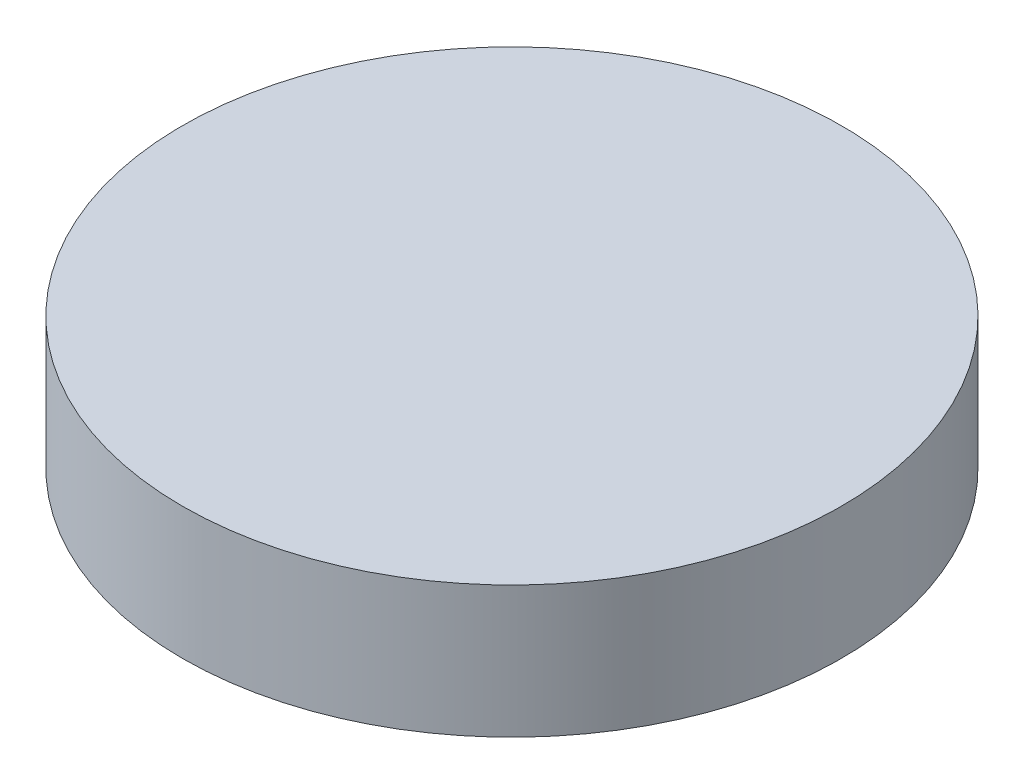
ISO-10303-21;
HEADER;
FILE_DESCRIPTION(('STEP AP214'),'2;1');
FILE_NAME('part.step','',(''),(''),'','','');
FILE_SCHEMA(('AUTOMOTIVE_DESIGN { 1 0 10303 214 1 1 1 1 }'));
ENDSEC;
DATA;
#1=APPLICATION_CONTEXT('core data for automotive mechanical design processes');
#2=APPLICATION_PROTOCOL_DEFINITION('international standard','automotive_design',2000,#1);
#3=PRODUCT_CONTEXT('',#1,'mechanical');
#4=PRODUCT('Part','Part','',(#3));
#5=PRODUCT_RELATED_PRODUCT_CATEGORY('part','',(#4));
#6=PRODUCT_DEFINITION_FORMATION('','',#4);
#7=PRODUCT_DEFINITION_CONTEXT('part definition',#1,'design');
#8=PRODUCT_DEFINITION('design','',#6,#7);
#9=PRODUCT_DEFINITION_SHAPE('','',#8);
#10=(LENGTH_UNIT() NAMED_UNIT(*) SI_UNIT(.MILLI.,.METRE.));
#11=(NAMED_UNIT(*) PLANE_ANGLE_UNIT() SI_UNIT($,.RADIAN.));
#12=(NAMED_UNIT(*) SI_UNIT($,.STERADIAN.) SOLID_ANGLE_UNIT());
#13=UNCERTAINTY_MEASURE_WITH_UNIT(LENGTH_MEASURE(1.E-05),#10,'distance_accuracy_value','');
#14=(GEOMETRIC_REPRESENTATION_CONTEXT(3) GLOBAL_UNCERTAINTY_ASSIGNED_CONTEXT((#13)) GLOBAL_UNIT_ASSIGNED_CONTEXT((#10,
#11,#12)) REPRESENTATION_CONTEXT('',''));
#15=CARTESIAN_POINT('',(0.,0.,0.));
#16=DIRECTION('',(0.,0.,1.));
#17=DIRECTION('',(1.,0.,0.));
#18=AXIS2_PLACEMENT_3D('',#15,#16,#17);
#19=CARTESIAN_POINT('',(0.,0.,0.));
#20=DIRECTION('',(0.,1.,0.));
#21=DIRECTION('',(0.,0.,1.));
#22=AXIS2_PLACEMENT_3D('',#19,#20,#21);
#23=PLANE('',#22);
#24=CARTESIAN_POINT('',(0.,0.,0.));
#25=DIRECTION('',(0.,1.,0.));
#26=DIRECTION('',(0.,0.,1.));
#27=AXIS2_PLACEMENT_3D('',#24,#25,#26);
#28=CIRCLE('',#27,330.);
#29=CARTESIAN_POINT('',(0.,0.,330.));
#30=VERTEX_POINT('',#29);
#31=EDGE_CURVE('E43',#30,#30,#28,.T.);
#32=ORIENTED_EDGE('',*,*,#31,.F.);
#33=EDGE_LOOP('',(#32));
#34=FACE_BOUND('',#33,.T.);
#35=DIRECTION('',(0.,0.,1.));
#36=VECTOR('',#35,1.);
#37=CARTESIAN_POINT('',(70.9937847516035,0.,-42.974654273376));
#38=LINE('',#37,#36);
#39=CARTESIAN_POINT('',(70.9937847516035,0.,-42.974654273376));
#40=VERTEX_POINT('',#39);
#41=CARTESIAN_POINT('',(70.9937847516035,0.,47.025345726624));
#42=VERTEX_POINT('',#41);
#43=EDGE_CURVE('E103',#40,#42,#38,.T.);
#44=ORIENTED_EDGE('',*,*,#43,.F.);
#45=DIRECTION('',(1.,0.,0.));
#46=VECTOR('',#45,1.);
#47=CARTESIAN_POINT('',(-19.0062152483965,0.,-42.974654273376));
#48=LINE('',#47,#46);
#49=CARTESIAN_POINT('',(-19.0062152483965,0.,-42.974654273376));
#50=VERTEX_POINT('',#49);
#51=EDGE_CURVE('E100',#50,#40,#48,.T.);
#52=ORIENTED_EDGE('',*,*,#51,.F.);
#53=DIRECTION('',(0.,0.,-1.));
#54=VECTOR('',#53,1.);
#55=CARTESIAN_POINT('',(-19.0062152483965,0.,-42.974654273376));
#56=LINE('',#55,#54);
#57=CARTESIAN_POINT('',(-19.0062152483965,0.,47.025345726624));
#58=VERTEX_POINT('',#57);
#59=EDGE_CURVE('E60',#58,#50,#56,.T.);
#60=ORIENTED_EDGE('',*,*,#59,.F.);
#61=DIRECTION('',(-1.,0.,0.));
#62=VECTOR('',#61,1.);
#63=CARTESIAN_POINT('',(-19.0062152483965,0.,47.025345726624));
#64=LINE('',#63,#62);
#65=EDGE_CURVE('E55',#42,#58,#64,.T.);
#66=ORIENTED_EDGE('',*,*,#65,.F.);
#67=EDGE_LOOP('',(#44,#52,#60,#66));
#68=FACE_BOUND('',#67,.T.);
#69=ADVANCED_FACE('F39',(#34,#68),#23,.F.);
#70=CARTESIAN_POINT('',(0.,132.,0.));
#71=DIRECTION('',(0.,-1.,0.));
#72=DIRECTION('',(0.,0.,-1.));
#73=AXIS2_PLACEMENT_3D('',#70,#71,#72);
#74=CYLINDRICAL_SURFACE('',#73,330.);
#75=CARTESIAN_POINT('',(0.,132.,0.));
#76=DIRECTION('',(0.,1.,0.));
#77=DIRECTION('',(0.,0.,1.));
#78=AXIS2_PLACEMENT_3D('',#75,#76,#77);
#79=CIRCLE('',#78,330.);
#80=CARTESIAN_POINT('',(0.,132.,330.));
#81=VERTEX_POINT('',#80);
#82=EDGE_CURVE('E11',#81,#81,#79,.T.);
#83=ORIENTED_EDGE('',*,*,#82,.F.);
#84=EDGE_LOOP('',(#83));
#85=FACE_BOUND('',#84,.T.);
#86=ORIENTED_EDGE('',*,*,#31,.T.);
#87=EDGE_LOOP('',(#86));
#88=FACE_BOUND('',#87,.T.);
#89=ADVANCED_FACE('F41',(#85,#88),#74,.T.);
#90=CARTESIAN_POINT('',(0.,132.,0.));
#91=DIRECTION('',(0.,1.,0.));
#92=DIRECTION('',(0.,0.,1.));
#93=AXIS2_PLACEMENT_3D('',#90,#91,#92);
#94=PLANE('',#93);
#95=ORIENTED_EDGE('',*,*,#82,.T.);
#96=EDGE_LOOP('',(#95));
#97=FACE_BOUND('',#96,.T.);
#98=ADVANCED_FACE('F140',(#97),#94,.T.);
#99=CARTESIAN_POINT('',(70.9937847516035,-34.,-42.974654273376));
#100=DIRECTION('',(-1.,0.,0.));
#101=DIRECTION('',(0.,0.,1.));
#102=AXIS2_PLACEMENT_3D('',#99,#100,#101);
#103=PLANE('',#102);
#104=ORIENTED_EDGE('',*,*,#43,.T.);
#105=DIRECTION('',(0.,1.,0.));
#106=VECTOR('',#105,1.);
#107=CARTESIAN_POINT('',(70.9937847516035,-34.,47.025345726624));
#108=LINE('',#107,#106);
#109=CARTESIAN_POINT('',(70.9937847516035,-34.,47.025345726624));
#110=VERTEX_POINT('',#109);
#111=EDGE_CURVE('E82',#110,#42,#108,.T.);
#112=ORIENTED_EDGE('',*,*,#111,.F.);
#113=DIRECTION('',(0.,0.,1.));
#114=VECTOR('',#113,1.);
#115=CARTESIAN_POINT('',(70.9937847516035,-34.,-42.974654273376));
#116=LINE('',#115,#114);
#117=CARTESIAN_POINT('',(70.9937847516035,-34.,-42.974654273376));
#118=VERTEX_POINT('',#117);
#119=EDGE_CURVE('E90',#118,#110,#116,.T.);
#120=ORIENTED_EDGE('',*,*,#119,.F.);
#121=DIRECTION('',(0.,1.,0.));
#122=VECTOR('',#121,1.);
#123=CARTESIAN_POINT('',(70.9937847516035,-34.,-42.974654273376));
#124=LINE('',#123,#122);
#125=EDGE_CURVE('E115',#118,#40,#124,.T.);
#126=ORIENTED_EDGE('',*,*,#125,.T.);
#127=EDGE_LOOP('',(#104,#112,#120,#126));
#128=FACE_BOUND('',#127,.T.);
#129=ADVANCED_FACE('F102',(#128),#103,.F.);
#130=CARTESIAN_POINT('',(-19.0062152483965,-34.,47.025345726624));
#131=DIRECTION('',(0.,0.,-1.));
#132=DIRECTION('',(-1.,0.,0.));
#133=AXIS2_PLACEMENT_3D('',#130,#131,#132);
#134=PLANE('',#133);
#135=ORIENTED_EDGE('',*,*,#65,.T.);
#136=DIRECTION('',(0.,1.,0.));
#137=VECTOR('',#136,1.);
#138=CARTESIAN_POINT('',(-19.0062152483965,-34.,47.025345726624));
#139=LINE('',#138,#137);
#140=CARTESIAN_POINT('',(-19.0062152483965,-34.,47.025345726624));
#141=VERTEX_POINT('',#140);
#142=EDGE_CURVE('E85',#141,#58,#139,.T.);
#143=ORIENTED_EDGE('',*,*,#142,.F.);
#144=DIRECTION('',(-1.,0.,0.));
#145=VECTOR('',#144,1.);
#146=CARTESIAN_POINT('',(-19.0062152483965,-34.,47.025345726624));
#147=LINE('',#146,#145);
#148=EDGE_CURVE('E78',#110,#141,#147,.T.);
#149=ORIENTED_EDGE('',*,*,#148,.F.);
#150=ORIENTED_EDGE('',*,*,#111,.T.);
#151=EDGE_LOOP('',(#135,#143,#149,#150));
#152=FACE_BOUND('',#151,.T.);
#153=ADVANCED_FACE('F80',(#152),#134,.F.);
#154=CARTESIAN_POINT('',(-19.0062152483965,-34.,-42.974654273376));
#155=DIRECTION('',(1.,0.,0.));
#156=DIRECTION('',(0.,0.,-1.));
#157=AXIS2_PLACEMENT_3D('',#154,#155,#156);
#158=PLANE('',#157);
#159=ORIENTED_EDGE('',*,*,#59,.T.);
#160=DIRECTION('',(0.,1.,0.));
#161=VECTOR('',#160,1.);
#162=CARTESIAN_POINT('',(-19.0062152483965,-34.,-42.974654273376));
#163=LINE('',#162,#161);
#164=CARTESIAN_POINT('',(-19.0062152483965,-34.,-42.974654273376));
#165=VERTEX_POINT('',#164);
#166=EDGE_CURVE('E109',#165,#50,#163,.T.);
#167=ORIENTED_EDGE('',*,*,#166,.F.);
#168=DIRECTION('',(0.,0.,-1.));
#169=VECTOR('',#168,1.);
#170=CARTESIAN_POINT('',(-19.0062152483965,-34.,-42.974654273376));
#171=LINE('',#170,#169);
#172=EDGE_CURVE('E89',#141,#165,#171,.T.);
#173=ORIENTED_EDGE('',*,*,#172,.F.);
#174=ORIENTED_EDGE('',*,*,#142,.T.);
#175=EDGE_LOOP('',(#159,#167,#173,#174));
#176=FACE_BOUND('',#175,.T.);
#177=ADVANCED_FACE('F132',(#176),#158,.F.);
#178=CARTESIAN_POINT('',(-19.0062152483965,-34.,-42.974654273376));
#179=DIRECTION('',(0.,0.,1.));
#180=DIRECTION('',(1.,0.,0.));
#181=AXIS2_PLACEMENT_3D('',#178,#179,#180);
#182=PLANE('',#181);
#183=ORIENTED_EDGE('',*,*,#51,.T.);
#184=ORIENTED_EDGE('',*,*,#125,.F.);
#185=DIRECTION('',(1.,0.,0.));
#186=VECTOR('',#185,1.);
#187=CARTESIAN_POINT('',(-19.0062152483965,-34.,-42.974654273376));
#188=LINE('',#187,#186);
#189=EDGE_CURVE('E95',#165,#118,#188,.T.);
#190=ORIENTED_EDGE('',*,*,#189,.F.);
#191=ORIENTED_EDGE('',*,*,#166,.T.);
#192=EDGE_LOOP('',(#183,#184,#190,#191));
#193=FACE_BOUND('',#192,.T.);
#194=ADVANCED_FACE('F134',(#193),#182,.F.);
#195=CARTESIAN_POINT('',(0.,-34.,0.));
#196=DIRECTION('',(0.,1.,0.));
#197=DIRECTION('',(0.,0.,1.));
#198=AXIS2_PLACEMENT_3D('',#195,#196,#197);
#199=PLANE('',#198);
#200=ORIENTED_EDGE('',*,*,#119,.T.);
#201=ORIENTED_EDGE('',*,*,#148,.T.);
#202=ORIENTED_EDGE('',*,*,#172,.T.);
#203=ORIENTED_EDGE('',*,*,#189,.T.);
#204=EDGE_LOOP('',(#200,#201,#202,#203));
#205=FACE_BOUND('',#204,.T.);
#206=ADVANCED_FACE('F93',(#205),#199,.F.);
#207=CLOSED_SHELL('',(#69,#89,#98,#129,#153,#177,#194,#206));
#208=MANIFOLD_SOLID_BREP('B2',#207);
#209=ADVANCED_BREP_SHAPE_REPRESENTATION('',(#18,#208),#14);
#210=SHAPE_DEFINITION_REPRESENTATION(#9,#209);
ENDSEC;
END-ISO-10303-21;
